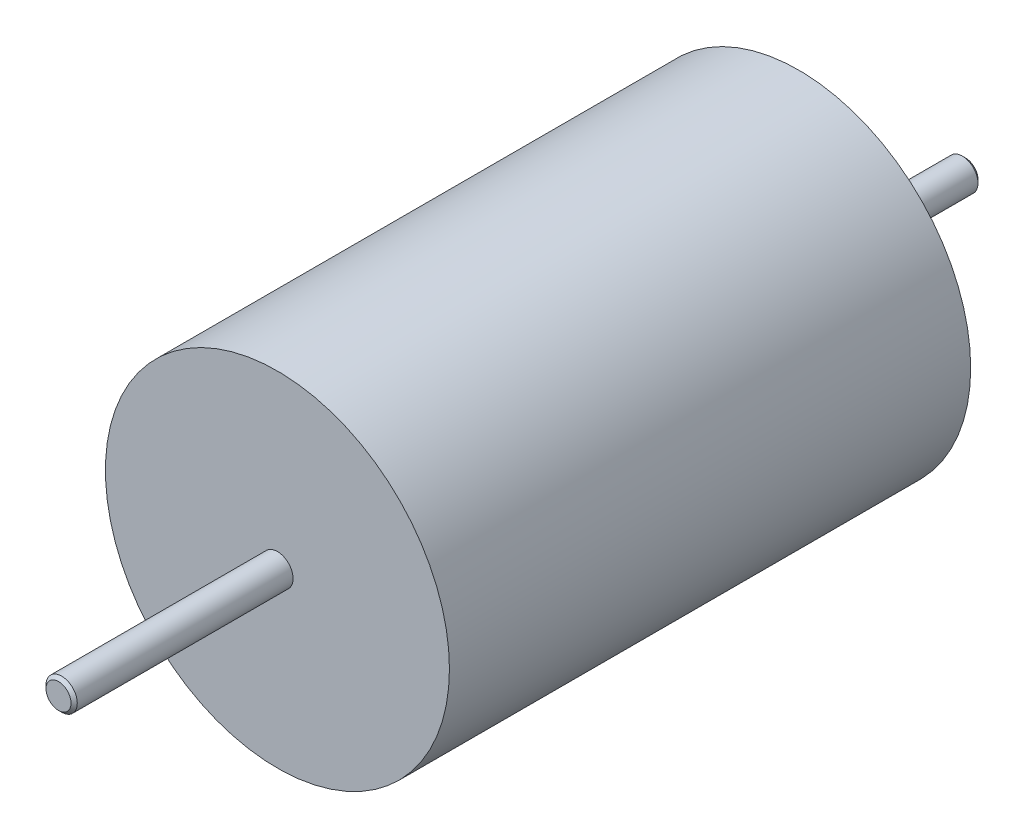
ISO-10303-21;
HEADER;
FILE_DESCRIPTION(('STEP AP214'),'2;1');
FILE_NAME('part.step','',(''),(''),'','','');
FILE_SCHEMA(('AUTOMOTIVE_DESIGN { 1 0 10303 214 1 1 1 1 }'));
ENDSEC;
DATA;
#1=APPLICATION_CONTEXT('core data for automotive mechanical design processes');
#2=APPLICATION_PROTOCOL_DEFINITION('international standard','automotive_design',2000,#1);
#3=PRODUCT_CONTEXT('',#1,'mechanical');
#4=PRODUCT('Part','Part','',(#3));
#5=PRODUCT_RELATED_PRODUCT_CATEGORY('part','',(#4));
#6=PRODUCT_DEFINITION_FORMATION('','',#4);
#7=PRODUCT_DEFINITION_CONTEXT('part definition',#1,'design');
#8=PRODUCT_DEFINITION('design','',#6,#7);
#9=PRODUCT_DEFINITION_SHAPE('','',#8);
#10=(LENGTH_UNIT() NAMED_UNIT(*) SI_UNIT(.MILLI.,.METRE.));
#11=(NAMED_UNIT(*) PLANE_ANGLE_UNIT() SI_UNIT($,.RADIAN.));
#12=(NAMED_UNIT(*) SI_UNIT($,.STERADIAN.) SOLID_ANGLE_UNIT());
#13=UNCERTAINTY_MEASURE_WITH_UNIT(LENGTH_MEASURE(1.E-05),#10,'distance_accuracy_value','');
#14=(GEOMETRIC_REPRESENTATION_CONTEXT(3) GLOBAL_UNCERTAINTY_ASSIGNED_CONTEXT((#13)) GLOBAL_UNIT_ASSIGNED_CONTEXT((#10,
#11,#12)) REPRESENTATION_CONTEXT('',''));
#15=CARTESIAN_POINT('',(0.,0.,0.));
#16=DIRECTION('',(0.,0.,1.));
#17=DIRECTION('',(1.,0.,0.));
#18=AXIS2_PLACEMENT_3D('',#15,#16,#17);
#19=CARTESIAN_POINT('',(0.,0.,43.5));
#20=DIRECTION('',(0.,0.,-1.));
#21=DIRECTION('',(-1.,0.,0.));
#22=AXIS2_PLACEMENT_3D('',#19,#20,#21);
#23=CYLINDRICAL_SURFACE('',#22,1.5);
#24=CARTESIAN_POINT('',(0.,0.,-43.2));
#25=DIRECTION('',(0.,0.,1.));
#26=DIRECTION('',(1.,0.,0.));
#27=AXIS2_PLACEMENT_3D('',#24,#25,#26);
#28=CIRCLE('',#27,1.5);
#29=CARTESIAN_POINT('',(1.5,0.,-43.2));
#30=VERTEX_POINT('',#29);
#31=EDGE_CURVE('E57',#30,#30,#28,.T.);
#32=ORIENTED_EDGE('',*,*,#31,.T.);
#33=EDGE_LOOP('',(#32));
#34=FACE_BOUND('',#33,.T.);
#35=CARTESIAN_POINT('',(0.,0.,-27.5));
#36=DIRECTION('',(0.,0.,1.));
#37=DIRECTION('',(1.,0.,0.));
#38=AXIS2_PLACEMENT_3D('',#35,#36,#37);
#39=CIRCLE('',#38,1.5);
#40=CARTESIAN_POINT('',(1.5,0.,-27.5));
#41=VERTEX_POINT('',#40);
#42=EDGE_CURVE('E63',#41,#41,#39,.T.);
#43=ORIENTED_EDGE('',*,*,#42,.F.);
#44=EDGE_LOOP('',(#43));
#45=FACE_BOUND('',#44,.T.);
#46=ADVANCED_FACE('F39',(#34,#45),#23,.T.);
#47=CARTESIAN_POINT('',(0.,0.,-43.5));
#48=DIRECTION('',(0.,0.,1.));
#49=DIRECTION('',(1.,0.,0.));
#50=AXIS2_PLACEMENT_3D('',#47,#48,#49);
#51=PLANE('',#50);
#52=CARTESIAN_POINT('',(0.,0.,-43.5));
#53=DIRECTION('',(0.,0.,1.));
#54=DIRECTION('',(1.,0.,0.));
#55=AXIS2_PLACEMENT_3D('',#52,#53,#54);
#56=CIRCLE('',#55,1.20000000000005);
#57=CARTESIAN_POINT('',(1.20000000000005,0.,-43.5));
#58=VERTEX_POINT('',#57);
#59=EDGE_CURVE('E52',#58,#58,#56,.F.);
#60=ORIENTED_EDGE('',*,*,#59,.T.);
#61=EDGE_LOOP('',(#60));
#62=FACE_BOUND('',#61,.T.);
#63=ADVANCED_FACE('F92',(#62),#51,.F.);
#64=CARTESIAN_POINT('',(0.,0.,-27.5));
#65=DIRECTION('',(0.,0.,1.));
#66=DIRECTION('',(1.,0.,0.));
#67=AXIS2_PLACEMENT_3D('',#64,#65,#66);
#68=CYLINDRICAL_SURFACE('',#67,16.5);
#69=CARTESIAN_POINT('',(0.,0.,-27.5));
#70=DIRECTION('',(0.,0.,1.));
#71=DIRECTION('',(1.,0.,0.));
#72=AXIS2_PLACEMENT_3D('',#69,#70,#71);
#73=CIRCLE('',#72,16.5);
#74=CARTESIAN_POINT('',(16.5,0.,-27.5));
#75=VERTEX_POINT('',#74);
#76=EDGE_CURVE('E67',#75,#75,#73,.T.);
#77=ORIENTED_EDGE('',*,*,#76,.T.);
#78=EDGE_LOOP('',(#77));
#79=FACE_BOUND('',#78,.T.);
#80=CARTESIAN_POINT('',(0.,0.,22.5));
#81=DIRECTION('',(0.,0.,1.));
#82=DIRECTION('',(1.,0.,0.));
#83=AXIS2_PLACEMENT_3D('',#80,#81,#82);
#84=CIRCLE('',#83,16.5);
#85=CARTESIAN_POINT('',(16.5,0.,22.5));
#86=VERTEX_POINT('',#85);
#87=EDGE_CURVE('E68',#86,#86,#84,.T.);
#88=ORIENTED_EDGE('',*,*,#87,.F.);
#89=EDGE_LOOP('',(#88));
#90=FACE_BOUND('',#89,.T.);
#91=ADVANCED_FACE('F90',(#79,#90),#68,.T.);
#92=CARTESIAN_POINT('',(0.,0.,-27.5));
#93=DIRECTION('',(0.,0.,1.));
#94=DIRECTION('',(1.,0.,0.));
#95=AXIS2_PLACEMENT_3D('',#92,#93,#94);
#96=PLANE('',#95);
#97=ORIENTED_EDGE('',*,*,#42,.T.);
#98=EDGE_LOOP('',(#97));
#99=FACE_BOUND('',#98,.T.);
#100=ORIENTED_EDGE('',*,*,#76,.F.);
#101=EDGE_LOOP('',(#100));
#102=FACE_BOUND('',#101,.T.);
#103=ADVANCED_FACE('F86',(#99,#102),#96,.F.);
#104=CARTESIAN_POINT('',(0.,0.,22.5));
#105=DIRECTION('',(0.,0.,1.));
#106=DIRECTION('',(1.,0.,0.));
#107=AXIS2_PLACEMENT_3D('',#104,#105,#106);
#108=PLANE('',#107);
#109=CARTESIAN_POINT('',(0.,0.,22.5));
#110=DIRECTION('',(0.,0.,1.));
#111=DIRECTION('',(1.,0.,0.));
#112=AXIS2_PLACEMENT_3D('',#109,#110,#111);
#113=CIRCLE('',#112,1.5);
#114=CARTESIAN_POINT('',(1.5,0.,22.5));
#115=VERTEX_POINT('',#114);
#116=EDGE_CURVE('E72',#115,#115,#113,.T.);
#117=ORIENTED_EDGE('',*,*,#116,.F.);
#118=EDGE_LOOP('',(#117));
#119=FACE_BOUND('',#118,.T.);
#120=ORIENTED_EDGE('',*,*,#87,.T.);
#121=EDGE_LOOP('',(#120));
#122=FACE_BOUND('',#121,.T.);
#123=ADVANCED_FACE('F82',(#119,#122),#108,.T.);
#124=CARTESIAN_POINT('',(0.,0.,43.5));
#125=DIRECTION('',(0.,0.,1.));
#126=DIRECTION('',(1.,0.,0.));
#127=AXIS2_PLACEMENT_3D('',#124,#125,#126);
#128=PLANE('',#127);
#129=CARTESIAN_POINT('',(0.,0.,43.5));
#130=DIRECTION('',(0.,0.,1.));
#131=DIRECTION('',(1.,0.,0.));
#132=AXIS2_PLACEMENT_3D('',#129,#130,#131);
#133=CIRCLE('',#132,1.20000000000002);
#134=CARTESIAN_POINT('',(1.20000000000002,0.,43.5));
#135=VERTEX_POINT('',#134);
#136=EDGE_CURVE('E47',#135,#135,#133,.T.);
#137=ORIENTED_EDGE('',*,*,#136,.T.);
#138=EDGE_LOOP('',(#137));
#139=FACE_BOUND('',#138,.T.);
#140=ADVANCED_FACE('F85',(#139),#128,.T.);
#141=CARTESIAN_POINT('',(0.,0.,43.2));
#142=DIRECTION('',(0.,0.,1.));
#143=DIRECTION('',(1.,0.,0.));
#144=AXIS2_PLACEMENT_3D('',#141,#142,#143);
#145=CIRCLE('',#144,1.5);
#146=CARTESIAN_POINT('',(1.5,0.,43.2));
#147=VERTEX_POINT('',#146);
#148=EDGE_CURVE('E10',#147,#147,#145,.F.);
#149=ORIENTED_EDGE('',*,*,#148,.T.);
#150=EDGE_LOOP('',(#149));
#151=FACE_BOUND('',#150,.T.);
#152=ORIENTED_EDGE('',*,*,#116,.T.);
#153=EDGE_LOOP('',(#152));
#154=FACE_BOUND('',#153,.T.);
#155=ADVANCED_FACE('F80',(#151,#154),#23,.T.);
#156=CARTESIAN_POINT('',(0.,0.,-43.2));
#157=DIRECTION('',(0.,0.,1.));
#158=DIRECTION('',(1.,0.,0.));
#159=AXIS2_PLACEMENT_3D('',#156,#157,#158);
#160=CONICAL_SURFACE('',#159,1.5,0.785398163397423);
#161=ORIENTED_EDGE('',*,*,#59,.F.);
#162=EDGE_LOOP('',(#161));
#163=FACE_BOUND('',#162,.T.);
#164=ORIENTED_EDGE('',*,*,#31,.F.);
#165=EDGE_LOOP('',(#164));
#166=FACE_BOUND('',#165,.T.);
#167=ADVANCED_FACE('F111',(#163,#166),#160,.T.);
#168=CARTESIAN_POINT('',(0.,0.,43.5));
#169=DIRECTION('',(0.,0.,-1.));
#170=DIRECTION('',(-1.,0.,0.));
#171=AXIS2_PLACEMENT_3D('',#168,#169,#170);
#172=CONICAL_SURFACE('',#171,1.20000000000002,0.785398163397435);
#173=ORIENTED_EDGE('',*,*,#148,.F.);
#174=EDGE_LOOP('',(#173));
#175=FACE_BOUND('',#174,.T.);
#176=ORIENTED_EDGE('',*,*,#136,.F.);
#177=EDGE_LOOP('',(#176));
#178=FACE_BOUND('',#177,.T.);
#179=ADVANCED_FACE('F41',(#175,#178),#172,.T.);
#180=CLOSED_SHELL('',(#46,#63,#91,#103,#123,#140,#155,#167,#179));
#181=MANIFOLD_SOLID_BREP('B2',#180);
#182=ADVANCED_BREP_SHAPE_REPRESENTATION('',(#18,#181),#14);
#183=SHAPE_DEFINITION_REPRESENTATION(#9,#182);
ENDSEC;
END-ISO-10303-21;
